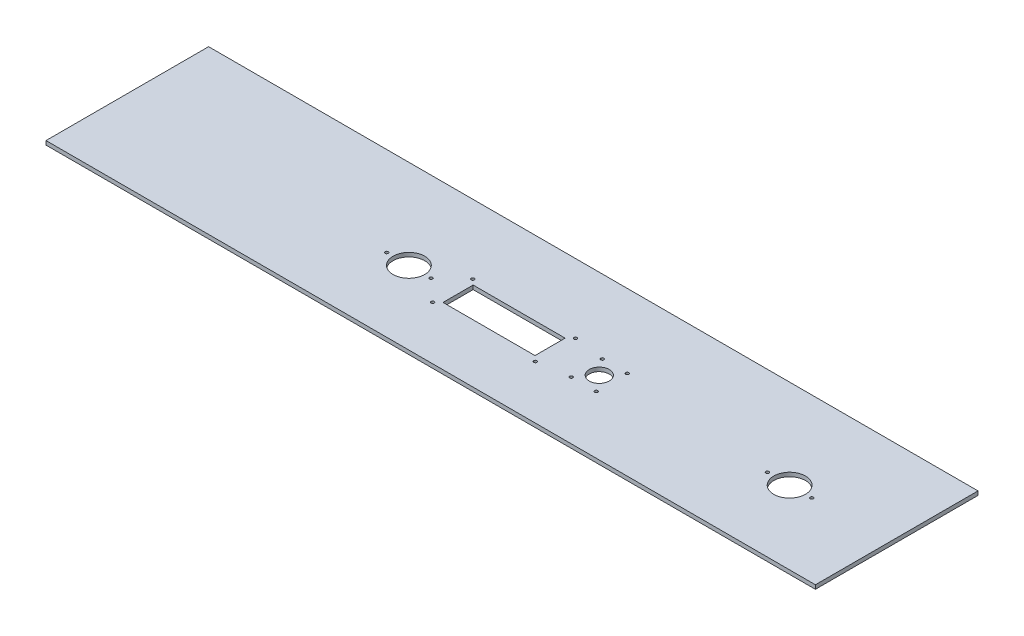
ISO-10303-21;
HEADER;
FILE_DESCRIPTION(('STEP AP214'),'2;1');
FILE_NAME('part.step','',(''),(''),'','','');
FILE_SCHEMA(('AUTOMOTIVE_DESIGN { 1 0 10303 214 1 1 1 1 }'));
ENDSEC;
DATA;
#1=APPLICATION_CONTEXT('core data for automotive mechanical design processes');
#2=APPLICATION_PROTOCOL_DEFINITION('international standard','automotive_design',2000,#1);
#3=PRODUCT_CONTEXT('',#1,'mechanical');
#4=PRODUCT('Part','Part','',(#3));
#5=PRODUCT_RELATED_PRODUCT_CATEGORY('part','',(#4));
#6=PRODUCT_DEFINITION_FORMATION('','',#4);
#7=PRODUCT_DEFINITION_CONTEXT('part definition',#1,'design');
#8=PRODUCT_DEFINITION('design','',#6,#7);
#9=PRODUCT_DEFINITION_SHAPE('','',#8);
#10=(LENGTH_UNIT() NAMED_UNIT(*) SI_UNIT(.MILLI.,.METRE.));
#11=(NAMED_UNIT(*) PLANE_ANGLE_UNIT() SI_UNIT($,.RADIAN.));
#12=(NAMED_UNIT(*) SI_UNIT($,.STERADIAN.) SOLID_ANGLE_UNIT());
#13=UNCERTAINTY_MEASURE_WITH_UNIT(LENGTH_MEASURE(1.E-05),#10,'distance_accuracy_value','');
#14=(GEOMETRIC_REPRESENTATION_CONTEXT(3) GLOBAL_UNCERTAINTY_ASSIGNED_CONTEXT((#13)) GLOBAL_UNIT_ASSIGNED_CONTEXT((#10,
#11,#12)) REPRESENTATION_CONTEXT('',''));
#15=CARTESIAN_POINT('',(0.,0.,0.));
#16=DIRECTION('',(0.,0.,1.));
#17=DIRECTION('',(1.,0.,0.));
#18=AXIS2_PLACEMENT_3D('',#15,#16,#17);
#19=CARTESIAN_POINT('',(307.975,3.175,65.0875));
#20=DIRECTION('',(-1.,0.,0.));
#21=DIRECTION('',(0.,0.,1.));
#22=AXIS2_PLACEMENT_3D('',#19,#20,#21);
#23=PLANE('',#22);
#24=DIRECTION('',(0.,0.,-1.));
#25=VECTOR('',#24,1.);
#26=CARTESIAN_POINT('',(307.975,0.,65.0875));
#27=LINE('',#26,#25);
#28=CARTESIAN_POINT('',(307.975,0.,65.0875));
#29=VERTEX_POINT('',#28);
#30=CARTESIAN_POINT('',(307.975,0.,-65.0875));
#31=VERTEX_POINT('',#30);
#32=EDGE_CURVE('E139',#29,#31,#27,.T.);
#33=ORIENTED_EDGE('',*,*,#32,.T.);
#34=DIRECTION('',(0.,-1.,0.));
#35=VECTOR('',#34,1.);
#36=CARTESIAN_POINT('',(307.975,3.175,-65.0875));
#37=LINE('',#36,#35);
#38=CARTESIAN_POINT('',(307.975,3.175,-65.0875));
#39=VERTEX_POINT('',#38);
#40=EDGE_CURVE('E11',#39,#31,#37,.T.);
#41=ORIENTED_EDGE('',*,*,#40,.F.);
#42=DIRECTION('',(0.,0.,-1.));
#43=VECTOR('',#42,1.);
#44=CARTESIAN_POINT('',(307.975,3.175,65.0875));
#45=LINE('',#44,#43);
#46=CARTESIAN_POINT('',(307.975,3.175,65.0875));
#47=VERTEX_POINT('',#46);
#48=EDGE_CURVE('E143',#47,#39,#45,.T.);
#49=ORIENTED_EDGE('',*,*,#48,.F.);
#50=DIRECTION('',(0.,-1.,0.));
#51=VECTOR('',#50,1.);
#52=CARTESIAN_POINT('',(307.975,3.175,65.0875));
#53=LINE('',#52,#51);
#54=EDGE_CURVE('E153',#47,#29,#53,.T.);
#55=ORIENTED_EDGE('',*,*,#54,.T.);
#56=EDGE_LOOP('',(#33,#41,#49,#55));
#57=FACE_BOUND('',#56,.T.);
#58=ADVANCED_FACE('F38',(#57),#23,.F.);
#59=CARTESIAN_POINT('',(-307.975,3.175,-65.0875));
#60=DIRECTION('',(0.,0.,1.));
#61=DIRECTION('',(1.,0.,0.));
#62=AXIS2_PLACEMENT_3D('',#59,#60,#61);
#63=PLANE('',#62);
#64=DIRECTION('',(-1.,0.,0.));
#65=VECTOR('',#64,1.);
#66=CARTESIAN_POINT('',(-307.975,0.,-65.0875));
#67=LINE('',#66,#65);
#68=CARTESIAN_POINT('',(-307.975,0.,-65.0875));
#69=VERTEX_POINT('',#68);
#70=EDGE_CURVE('E156',#31,#69,#67,.T.);
#71=ORIENTED_EDGE('',*,*,#70,.T.);
#72=DIRECTION('',(0.,-1.,0.));
#73=VECTOR('',#72,1.);
#74=CARTESIAN_POINT('',(-307.975,3.175,-65.0875));
#75=LINE('',#74,#73);
#76=CARTESIAN_POINT('',(-307.975,3.175,-65.0875));
#77=VERTEX_POINT('',#76);
#78=EDGE_CURVE('E45',#77,#69,#75,.T.);
#79=ORIENTED_EDGE('',*,*,#78,.F.);
#80=DIRECTION('',(-1.,0.,0.));
#81=VECTOR('',#80,1.);
#82=CARTESIAN_POINT('',(-307.975,3.175,-65.0875));
#83=LINE('',#82,#81);
#84=EDGE_CURVE('E146',#39,#77,#83,.T.);
#85=ORIENTED_EDGE('',*,*,#84,.F.);
#86=ORIENTED_EDGE('',*,*,#40,.T.);
#87=EDGE_LOOP('',(#71,#79,#85,#86));
#88=FACE_BOUND('',#87,.T.);
#89=ADVANCED_FACE('F184',(#88),#63,.F.);
#90=CARTESIAN_POINT('',(-307.975,3.175,65.0875));
#91=DIRECTION('',(1.,0.,0.));
#92=DIRECTION('',(0.,0.,-1.));
#93=AXIS2_PLACEMENT_3D('',#90,#91,#92);
#94=PLANE('',#93);
#95=DIRECTION('',(0.,0.,1.));
#96=VECTOR('',#95,1.);
#97=CARTESIAN_POINT('',(-307.975,0.,65.0875));
#98=LINE('',#97,#96);
#99=CARTESIAN_POINT('',(-307.975,0.,65.0875));
#100=VERTEX_POINT('',#99);
#101=EDGE_CURVE('E158',#69,#100,#98,.T.);
#102=ORIENTED_EDGE('',*,*,#101,.T.);
#103=DIRECTION('',(0.,-1.,0.));
#104=VECTOR('',#103,1.);
#105=CARTESIAN_POINT('',(-307.975,3.175,65.0875));
#106=LINE('',#105,#104);
#107=CARTESIAN_POINT('',(-307.975,3.175,65.0875));
#108=VERTEX_POINT('',#107);
#109=EDGE_CURVE('E163',#108,#100,#106,.T.);
#110=ORIENTED_EDGE('',*,*,#109,.F.);
#111=DIRECTION('',(0.,0.,1.));
#112=VECTOR('',#111,1.);
#113=CARTESIAN_POINT('',(-307.975,3.175,65.0875));
#114=LINE('',#113,#112);
#115=EDGE_CURVE('E149',#77,#108,#114,.T.);
#116=ORIENTED_EDGE('',*,*,#115,.F.);
#117=ORIENTED_EDGE('',*,*,#78,.T.);
#118=EDGE_LOOP('',(#102,#110,#116,#117));
#119=FACE_BOUND('',#118,.T.);
#120=ADVANCED_FACE('F170',(#119),#94,.F.);
#121=CARTESIAN_POINT('',(-307.975,3.175,65.0875));
#122=DIRECTION('',(0.,0.,-1.));
#123=DIRECTION('',(-1.,0.,0.));
#124=AXIS2_PLACEMENT_3D('',#121,#122,#123);
#125=PLANE('',#124);
#126=DIRECTION('',(1.,0.,0.));
#127=VECTOR('',#126,1.);
#128=CARTESIAN_POINT('',(-307.975,0.,65.0875));
#129=LINE('',#128,#127);
#130=EDGE_CURVE('E147',#100,#29,#129,.T.);
#131=ORIENTED_EDGE('',*,*,#130,.T.);
#132=ORIENTED_EDGE('',*,*,#54,.F.);
#133=DIRECTION('',(1.,0.,0.));
#134=VECTOR('',#133,1.);
#135=CARTESIAN_POINT('',(-307.975,3.175,65.0875));
#136=LINE('',#135,#134);
#137=EDGE_CURVE('E151',#108,#47,#136,.T.);
#138=ORIENTED_EDGE('',*,*,#137,.F.);
#139=ORIENTED_EDGE('',*,*,#109,.T.);
#140=EDGE_LOOP('',(#131,#132,#138,#139));
#141=FACE_BOUND('',#140,.T.);
#142=ADVANCED_FACE('F177',(#141),#125,.F.);
#143=CARTESIAN_POINT('',(0.,3.175,0.));
#144=DIRECTION('',(0.,-1.,0.));
#145=DIRECTION('',(0.,0.,-1.));
#146=AXIS2_PLACEMENT_3D('',#143,#144,#145);
#147=PLANE('',#146);
#148=CARTESIAN_POINT('',(86.2,3.175,18.85));
#149=DIRECTION('',(0.,1.,0.));
#150=DIRECTION('',(0.,0.,1.));
#151=AXIS2_PLACEMENT_3D('',#148,#149,#150);
#152=CIRCLE('',#151,1.25);
#153=CARTESIAN_POINT('',(86.2,3.175,20.1));
#154=VERTEX_POINT('',#153);
#155=EDGE_CURVE('E338',#154,#154,#152,.T.);
#156=ORIENTED_EDGE('',*,*,#155,.F.);
#157=EDGE_LOOP('',(#156));
#158=FACE_BOUND('',#157,.T.);
#159=CARTESIAN_POINT('',(-58.42,3.175,6.35));
#160=DIRECTION('',(0.,1.,0.));
#161=DIRECTION('',(0.,0.,1.));
#162=AXIS2_PLACEMENT_3D('',#159,#160,#161);
#163=CIRCLE('',#162,1.25);
#164=CARTESIAN_POINT('',(-58.42,3.175,7.60000000000001));
#165=VERTEX_POINT('',#164);
#166=EDGE_CURVE('E332',#165,#165,#163,.T.);
#167=ORIENTED_EDGE('',*,*,#166,.F.);
#168=EDGE_LOOP('',(#167));
#169=FACE_BOUND('',#168,.T.);
#170=CARTESIAN_POINT('',(-93.98,3.175,6.35));
#171=DIRECTION('',(0.,1.,0.));
#172=DIRECTION('',(0.,0.,1.));
#173=AXIS2_PLACEMENT_3D('',#170,#171,#172);
#174=CIRCLE('',#173,1.25);
#175=CARTESIAN_POINT('',(-93.98,3.175,7.6));
#176=VERTEX_POINT('',#175);
#177=EDGE_CURVE('E326',#176,#176,#174,.T.);
#178=ORIENTED_EDGE('',*,*,#177,.F.);
#179=EDGE_LOOP('',(#178));
#180=FACE_BOUND('',#179,.T.);
#181=CARTESIAN_POINT('',(-76.2,3.175,6.35));
#182=DIRECTION('',(0.,1.,0.));
#183=DIRECTION('',(0.,0.,1.));
#184=AXIS2_PLACEMENT_3D('',#181,#182,#183);
#185=CIRCLE('',#184,12.7);
#186=CARTESIAN_POINT('',(-76.2,3.175,19.05));
#187=VERTEX_POINT('',#186);
#188=EDGE_CURVE('E320',#187,#187,#185,.T.);
#189=ORIENTED_EDGE('',*,*,#188,.F.);
#190=EDGE_LOOP('',(#189));
#191=FACE_BOUND('',#190,.T.);
#192=CARTESIAN_POINT('',(-41.099999842,3.175,-9.69999990399998));
#193=DIRECTION('',(0.,1.,0.));
#194=DIRECTION('',(0.,0.,-1.));
#195=AXIS2_PLACEMENT_3D('',#192,#193,#194);
#196=CIRCLE('',#195,1.25);
#197=CARTESIAN_POINT('',(-41.099999842,3.175,-10.949999904));
#198=VERTEX_POINT('',#197);
#199=EDGE_CURVE('E359',#198,#198,#196,.T.);
#200=ORIENTED_EDGE('',*,*,#199,.F.);
#201=EDGE_LOOP('',(#200));
#202=FACE_BOUND('',#201,.T.);
#203=CARTESIAN_POINT('',(-41.099999842,3.175,22.399999904));
#204=DIRECTION('',(0.,1.,0.));
#205=DIRECTION('',(0.,0.,1.));
#206=AXIS2_PLACEMENT_3D('',#203,#204,#205);
#207=CIRCLE('',#206,1.25);
#208=CARTESIAN_POINT('',(-41.099999842,3.175,23.649999904));
#209=VERTEX_POINT('',#208);
#210=EDGE_CURVE('E354',#209,#209,#207,.T.);
#211=ORIENTED_EDGE('',*,*,#210,.F.);
#212=EDGE_LOOP('',(#211));
#213=FACE_BOUND('',#212,.T.);
#214=CARTESIAN_POINT('',(41.099999842,3.175,22.399999904));
#215=DIRECTION('',(0.,1.,0.));
#216=DIRECTION('',(0.,0.,-1.));
#217=AXIS2_PLACEMENT_3D('',#214,#215,#216);
#218=CIRCLE('',#217,1.25);
#219=CARTESIAN_POINT('',(41.099999842,3.175,21.149999904));
#220=VERTEX_POINT('',#219);
#221=EDGE_CURVE('E348',#220,#220,#218,.T.);
#222=ORIENTED_EDGE('',*,*,#221,.F.);
#223=EDGE_LOOP('',(#222));
#224=FACE_BOUND('',#223,.T.);
#225=CARTESIAN_POINT('',(41.099999842,3.175,-9.69999990399999));
#226=DIRECTION('',(0.,1.,0.));
#227=DIRECTION('',(0.,0.,1.));
#228=AXIS2_PLACEMENT_3D('',#225,#226,#227);
#229=CIRCLE('',#228,1.25);
#230=CARTESIAN_POINT('',(41.099999842,3.175,-8.449999904));
#231=VERTEX_POINT('',#230);
#232=EDGE_CURVE('E133',#231,#231,#229,.T.);
#233=ORIENTED_EDGE('',*,*,#232,.F.);
#234=EDGE_LOOP('',(#233));
#235=FACE_BOUND('',#234,.T.);
#236=CARTESIAN_POINT('',(76.2,3.175,6.35));
#237=DIRECTION('',(0.,1.,0.));
#238=DIRECTION('',(0.,0.,1.));
#239=AXIS2_PLACEMENT_3D('',#236,#237,#238);
#240=CIRCLE('',#239,8.00000000000001);
#241=CARTESIAN_POINT('',(76.2,3.175,14.35));
#242=VERTEX_POINT('',#241);
#243=EDGE_CURVE('E285',#242,#242,#240,.T.);
#244=ORIENTED_EDGE('',*,*,#243,.F.);
#245=EDGE_LOOP('',(#244));
#246=FACE_BOUND('',#245,.T.);
#247=CARTESIAN_POINT('',(66.2,3.175,-6.15));
#248=DIRECTION('',(0.,1.,0.));
#249=DIRECTION('',(0.,0.,1.));
#250=AXIS2_PLACEMENT_3D('',#247,#248,#249);
#251=CIRCLE('',#250,1.25);
#252=CARTESIAN_POINT('',(66.2,3.175,-4.9));
#253=VERTEX_POINT('',#252);
#254=EDGE_CURVE('E278',#253,#253,#251,.T.);
#255=ORIENTED_EDGE('',*,*,#254,.F.);
#256=EDGE_LOOP('',(#255));
#257=FACE_BOUND('',#256,.T.);
#258=CARTESIAN_POINT('',(66.2,3.175,18.85));
#259=DIRECTION('',(0.,1.,0.));
#260=DIRECTION('',(0.,0.,1.));
#261=AXIS2_PLACEMENT_3D('',#258,#259,#260);
#262=CIRCLE('',#261,1.25);
#263=CARTESIAN_POINT('',(66.2,3.175,20.1));
#264=VERTEX_POINT('',#263);
#265=EDGE_CURVE('E283',#264,#264,#262,.T.);
#266=ORIENTED_EDGE('',*,*,#265,.F.);
#267=EDGE_LOOP('',(#266));
#268=FACE_BOUND('',#267,.T.);
#269=CARTESIAN_POINT('',(86.2,3.175,-6.15));
#270=DIRECTION('',(0.,1.,0.));
#271=DIRECTION('',(0.,0.,1.));
#272=AXIS2_PLACEMENT_3D('',#269,#270,#271);
#273=CIRCLE('',#272,1.25);
#274=CARTESIAN_POINT('',(86.2,3.175,-4.9));
#275=VERTEX_POINT('',#274);
#276=EDGE_CURVE('E294',#275,#275,#273,.T.);
#277=ORIENTED_EDGE('',*,*,#276,.F.);
#278=EDGE_LOOP('',(#277));
#279=FACE_BOUND('',#278,.T.);
#280=CARTESIAN_POINT('',(228.6,3.175,6.34999999999995));
#281=DIRECTION('',(0.,1.,0.));
#282=DIRECTION('',(0.,0.,-1.));
#283=AXIS2_PLACEMENT_3D('',#280,#281,#282);
#284=CIRCLE('',#283,12.7);
#285=CARTESIAN_POINT('',(228.6,3.175,-6.3500000000001));
#286=VERTEX_POINT('',#285);
#287=EDGE_CURVE('E303',#286,#286,#284,.T.);
#288=ORIENTED_EDGE('',*,*,#287,.F.);
#289=EDGE_LOOP('',(#288));
#290=FACE_BOUND('',#289,.T.);
#291=CARTESIAN_POINT('',(210.82,3.175,6.34999999999995));
#292=DIRECTION('',(0.,1.,0.));
#293=DIRECTION('',(0.,0.,-1.));
#294=AXIS2_PLACEMENT_3D('',#291,#292,#293);
#295=CIRCLE('',#294,1.25000000000001);
#296=CARTESIAN_POINT('',(210.82,3.175,5.09999999999994));
#297=VERTEX_POINT('',#296);
#298=EDGE_CURVE('E315',#297,#297,#295,.T.);
#299=ORIENTED_EDGE('',*,*,#298,.F.);
#300=EDGE_LOOP('',(#299));
#301=FACE_BOUND('',#300,.T.);
#302=CARTESIAN_POINT('',(246.38,3.175,6.34999999999992));
#303=DIRECTION('',(0.,1.,0.));
#304=DIRECTION('',(0.,0.,-1.));
#305=AXIS2_PLACEMENT_3D('',#302,#303,#304);
#306=CIRCLE('',#305,1.25000000000004);
#307=CARTESIAN_POINT('',(246.38,3.175,5.09999999999988));
#308=VERTEX_POINT('',#307);
#309=EDGE_CURVE('E293',#308,#308,#306,.T.);
#310=ORIENTED_EDGE('',*,*,#309,.F.);
#311=EDGE_LOOP('',(#310));
#312=FACE_BOUND('',#311,.T.);
#313=DIRECTION('',(-1.,0.,0.));
#314=VECTOR('',#313,1.);
#315=CARTESIAN_POINT('',(-36.83,3.175,-5.715));
#316=LINE('',#315,#314);
#317=CARTESIAN_POINT('',(36.83,3.175,-5.715));
#318=VERTEX_POINT('',#317);
#319=CARTESIAN_POINT('',(-36.83,3.175,-5.715));
#320=VERTEX_POINT('',#319);
#321=EDGE_CURVE('E132',#318,#320,#316,.T.);
#322=ORIENTED_EDGE('',*,*,#321,.F.);
#323=DIRECTION('',(0.,0.,-1.));
#324=VECTOR('',#323,1.);
#325=CARTESIAN_POINT('',(36.83,3.175,18.415));
#326=LINE('',#325,#324);
#327=CARTESIAN_POINT('',(36.83,3.175,18.415));
#328=VERTEX_POINT('',#327);
#329=EDGE_CURVE('E52',#328,#318,#326,.T.);
#330=ORIENTED_EDGE('',*,*,#329,.F.);
#331=DIRECTION('',(1.,0.,0.));
#332=VECTOR('',#331,1.);
#333=CARTESIAN_POINT('',(-36.83,3.175,18.415));
#334=LINE('',#333,#332);
#335=CARTESIAN_POINT('',(-36.83,3.175,18.415));
#336=VERTEX_POINT('',#335);
#337=EDGE_CURVE('E120',#336,#328,#334,.T.);
#338=ORIENTED_EDGE('',*,*,#337,.F.);
#339=DIRECTION('',(0.,0.,1.));
#340=VECTOR('',#339,1.);
#341=CARTESIAN_POINT('',(-36.83,3.175,18.415));
#342=LINE('',#341,#340);
#343=EDGE_CURVE('E123',#320,#336,#342,.T.);
#344=ORIENTED_EDGE('',*,*,#343,.F.);
#345=EDGE_LOOP('',(#322,#330,#338,#344));
#346=FACE_BOUND('',#345,.T.);
#347=ORIENTED_EDGE('',*,*,#48,.T.);
#348=ORIENTED_EDGE('',*,*,#84,.T.);
#349=ORIENTED_EDGE('',*,*,#115,.T.);
#350=ORIENTED_EDGE('',*,*,#137,.T.);
#351=EDGE_LOOP('',(#347,#348,#349,#350));
#352=FACE_BOUND('',#351,.T.);
#353=ADVANCED_FACE('F183',(#158,#169,#180,#191,#202,#213,#224,#235,#246,#257,#268,#279,#290,
#301,#312,#346,#352),#147,.F.);
#354=CARTESIAN_POINT('',(0.,0.,0.));
#355=DIRECTION('',(0.,-1.,0.));
#356=DIRECTION('',(0.,0.,-1.));
#357=AXIS2_PLACEMENT_3D('',#354,#355,#356);
#358=PLANE('',#357);
#359=CARTESIAN_POINT('',(86.2,0.,18.85));
#360=DIRECTION('',(0.,1.,0.));
#361=DIRECTION('',(0.,0.,1.));
#362=AXIS2_PLACEMENT_3D('',#359,#360,#361);
#363=CIRCLE('',#362,1.25);
#364=CARTESIAN_POINT('',(86.2,0.,20.1));
#365=VERTEX_POINT('',#364);
#366=EDGE_CURVE('E297',#365,#365,#363,.T.);
#367=ORIENTED_EDGE('',*,*,#366,.T.);
#368=EDGE_LOOP('',(#367));
#369=FACE_BOUND('',#368,.T.);
#370=CARTESIAN_POINT('',(-58.42,0.,6.35));
#371=DIRECTION('',(0.,1.,0.));
#372=DIRECTION('',(0.,0.,1.));
#373=AXIS2_PLACEMENT_3D('',#370,#371,#372);
#374=CIRCLE('',#373,1.25);
#375=CARTESIAN_POINT('',(-58.42,0.,7.60000000000001));
#376=VERTEX_POINT('',#375);
#377=EDGE_CURVE('E335',#376,#376,#374,.T.);
#378=ORIENTED_EDGE('',*,*,#377,.T.);
#379=EDGE_LOOP('',(#378));
#380=FACE_BOUND('',#379,.T.);
#381=CARTESIAN_POINT('',(-93.98,0.,6.35));
#382=DIRECTION('',(0.,1.,0.));
#383=DIRECTION('',(0.,0.,1.));
#384=AXIS2_PLACEMENT_3D('',#381,#382,#383);
#385=CIRCLE('',#384,1.25);
#386=CARTESIAN_POINT('',(-93.98,0.,7.6));
#387=VERTEX_POINT('',#386);
#388=EDGE_CURVE('E329',#387,#387,#385,.T.);
#389=ORIENTED_EDGE('',*,*,#388,.T.);
#390=EDGE_LOOP('',(#389));
#391=FACE_BOUND('',#390,.T.);
#392=CARTESIAN_POINT('',(-76.2,0.,6.35));
#393=DIRECTION('',(0.,1.,0.));
#394=DIRECTION('',(0.,0.,1.));
#395=AXIS2_PLACEMENT_3D('',#392,#393,#394);
#396=CIRCLE('',#395,12.7);
#397=CARTESIAN_POINT('',(-76.2,0.,19.05));
#398=VERTEX_POINT('',#397);
#399=EDGE_CURVE('E323',#398,#398,#396,.T.);
#400=ORIENTED_EDGE('',*,*,#399,.T.);
#401=EDGE_LOOP('',(#400));
#402=FACE_BOUND('',#401,.T.);
#403=CARTESIAN_POINT('',(-41.099999842,0.,-9.69999990399998));
#404=DIRECTION('',(0.,1.,0.));
#405=DIRECTION('',(0.,0.,-1.));
#406=AXIS2_PLACEMENT_3D('',#403,#404,#405);
#407=CIRCLE('',#406,1.25);
#408=CARTESIAN_POINT('',(-41.099999842,0.,-10.949999904));
#409=VERTEX_POINT('',#408);
#410=EDGE_CURVE('E126',#409,#409,#407,.T.);
#411=ORIENTED_EDGE('',*,*,#410,.T.);
#412=EDGE_LOOP('',(#411));
#413=FACE_BOUND('',#412,.T.);
#414=CARTESIAN_POINT('',(-41.099999842,0.,22.399999904));
#415=DIRECTION('',(0.,1.,0.));
#416=DIRECTION('',(0.,0.,1.));
#417=AXIS2_PLACEMENT_3D('',#414,#415,#416);
#418=CIRCLE('',#417,1.25);
#419=CARTESIAN_POINT('',(-41.099999842,0.,23.649999904));
#420=VERTEX_POINT('',#419);
#421=EDGE_CURVE('E357',#420,#420,#418,.T.);
#422=ORIENTED_EDGE('',*,*,#421,.T.);
#423=EDGE_LOOP('',(#422));
#424=FACE_BOUND('',#423,.T.);
#425=CARTESIAN_POINT('',(41.099999842,0.,22.399999904));
#426=DIRECTION('',(0.,1.,0.));
#427=DIRECTION('',(0.,0.,-1.));
#428=AXIS2_PLACEMENT_3D('',#425,#426,#427);
#429=CIRCLE('',#428,1.25);
#430=CARTESIAN_POINT('',(41.099999842,0.,21.149999904));
#431=VERTEX_POINT('',#430);
#432=EDGE_CURVE('E351',#431,#431,#429,.T.);
#433=ORIENTED_EDGE('',*,*,#432,.T.);
#434=EDGE_LOOP('',(#433));
#435=FACE_BOUND('',#434,.T.);
#436=CARTESIAN_POINT('',(41.099999842,0.,-9.69999990399999));
#437=DIRECTION('',(0.,1.,0.));
#438=DIRECTION('',(0.,0.,1.));
#439=AXIS2_PLACEMENT_3D('',#436,#437,#438);
#440=CIRCLE('',#439,1.25);
#441=CARTESIAN_POINT('',(41.099999842,0.,-8.449999904));
#442=VERTEX_POINT('',#441);
#443=EDGE_CURVE('E345',#442,#442,#440,.T.);
#444=ORIENTED_EDGE('',*,*,#443,.T.);
#445=EDGE_LOOP('',(#444));
#446=FACE_BOUND('',#445,.T.);
#447=CARTESIAN_POINT('',(76.2,0.,6.35));
#448=DIRECTION('',(0.,1.,0.));
#449=DIRECTION('',(0.,0.,1.));
#450=AXIS2_PLACEMENT_3D('',#447,#448,#449);
#451=CIRCLE('',#450,8.00000000000001);
#452=CARTESIAN_POINT('',(76.2,0.,14.35));
#453=VERTEX_POINT('',#452);
#454=EDGE_CURVE('E290',#453,#453,#451,.T.);
#455=ORIENTED_EDGE('',*,*,#454,.T.);
#456=EDGE_LOOP('',(#455));
#457=FACE_BOUND('',#456,.T.);
#458=CARTESIAN_POINT('',(66.2,0.,-6.15));
#459=DIRECTION('',(0.,1.,0.));
#460=DIRECTION('',(0.,0.,1.));
#461=AXIS2_PLACEMENT_3D('',#458,#459,#460);
#462=CIRCLE('',#461,1.25);
#463=CARTESIAN_POINT('',(66.2,0.,-4.9));
#464=VERTEX_POINT('',#463);
#465=EDGE_CURVE('E275',#464,#464,#462,.T.);
#466=ORIENTED_EDGE('',*,*,#465,.T.);
#467=EDGE_LOOP('',(#466));
#468=FACE_BOUND('',#467,.T.);
#469=CARTESIAN_POINT('',(66.2,0.,18.85));
#470=DIRECTION('',(0.,1.,0.));
#471=DIRECTION('',(0.,0.,1.));
#472=AXIS2_PLACEMENT_3D('',#469,#470,#471);
#473=CIRCLE('',#472,1.25);
#474=CARTESIAN_POINT('',(66.2,0.,20.1));
#475=VERTEX_POINT('',#474);
#476=EDGE_CURVE('E280',#475,#475,#473,.T.);
#477=ORIENTED_EDGE('',*,*,#476,.T.);
#478=EDGE_LOOP('',(#477));
#479=FACE_BOUND('',#478,.T.);
#480=CARTESIAN_POINT('',(86.2,0.,-6.15));
#481=DIRECTION('',(0.,1.,0.));
#482=DIRECTION('',(0.,0.,1.));
#483=AXIS2_PLACEMENT_3D('',#480,#481,#482);
#484=CIRCLE('',#483,1.25);
#485=CARTESIAN_POINT('',(86.2,0.,-4.9));
#486=VERTEX_POINT('',#485);
#487=EDGE_CURVE('E298',#486,#486,#484,.T.);
#488=ORIENTED_EDGE('',*,*,#487,.T.);
#489=EDGE_LOOP('',(#488));
#490=FACE_BOUND('',#489,.T.);
#491=CARTESIAN_POINT('',(228.6,0.,6.34999999999995));
#492=DIRECTION('',(0.,1.,0.));
#493=DIRECTION('',(0.,0.,-1.));
#494=AXIS2_PLACEMENT_3D('',#491,#492,#493);
#495=CIRCLE('',#494,12.7);
#496=CARTESIAN_POINT('',(228.6,0.,-6.3500000000001));
#497=VERTEX_POINT('',#496);
#498=EDGE_CURVE('E307',#497,#497,#495,.T.);
#499=ORIENTED_EDGE('',*,*,#498,.T.);
#500=EDGE_LOOP('',(#499));
#501=FACE_BOUND('',#500,.T.);
#502=CARTESIAN_POINT('',(210.82,0.,6.34999999999995));
#503=DIRECTION('',(0.,1.,0.));
#504=DIRECTION('',(0.,0.,-1.));
#505=AXIS2_PLACEMENT_3D('',#502,#503,#504);
#506=CIRCLE('',#505,1.25000000000001);
#507=CARTESIAN_POINT('',(210.82,0.,5.09999999999994));
#508=VERTEX_POINT('',#507);
#509=EDGE_CURVE('E306',#508,#508,#506,.T.);
#510=ORIENTED_EDGE('',*,*,#509,.T.);
#511=EDGE_LOOP('',(#510));
#512=FACE_BOUND('',#511,.T.);
#513=CARTESIAN_POINT('',(246.38,0.,6.34999999999992));
#514=DIRECTION('',(0.,1.,0.));
#515=DIRECTION('',(0.,0.,-1.));
#516=AXIS2_PLACEMENT_3D('',#513,#514,#515);
#517=CIRCLE('',#516,1.25000000000004);
#518=CARTESIAN_POINT('',(246.38,0.,5.09999999999988));
#519=VERTEX_POINT('',#518);
#520=EDGE_CURVE('E312',#519,#519,#517,.T.);
#521=ORIENTED_EDGE('',*,*,#520,.T.);
#522=EDGE_LOOP('',(#521));
#523=FACE_BOUND('',#522,.T.);
#524=DIRECTION('',(0.,0.,-1.));
#525=VECTOR('',#524,1.);
#526=CARTESIAN_POINT('',(36.83,0.,18.415));
#527=LINE('',#526,#525);
#528=CARTESIAN_POINT('',(36.83,0.,18.415));
#529=VERTEX_POINT('',#528);
#530=CARTESIAN_POINT('',(36.83,0.,-5.715));
#531=VERTEX_POINT('',#530);
#532=EDGE_CURVE('E104',#529,#531,#527,.T.);
#533=ORIENTED_EDGE('',*,*,#532,.T.);
#534=DIRECTION('',(-1.,0.,0.));
#535=VECTOR('',#534,1.);
#536=CARTESIAN_POINT('',(-36.83,0.,-5.715));
#537=LINE('',#536,#535);
#538=CARTESIAN_POINT('',(-36.83,0.,-5.715));
#539=VERTEX_POINT('',#538);
#540=EDGE_CURVE('E113',#531,#539,#537,.T.);
#541=ORIENTED_EDGE('',*,*,#540,.T.);
#542=DIRECTION('',(0.,0.,1.));
#543=VECTOR('',#542,1.);
#544=CARTESIAN_POINT('',(-36.83,0.,18.415));
#545=LINE('',#544,#543);
#546=CARTESIAN_POINT('',(-36.83,0.,18.415));
#547=VERTEX_POINT('',#546);
#548=EDGE_CURVE('E60',#539,#547,#545,.T.);
#549=ORIENTED_EDGE('',*,*,#548,.T.);
#550=DIRECTION('',(1.,0.,0.));
#551=VECTOR('',#550,1.);
#552=CARTESIAN_POINT('',(-36.83,0.,18.415));
#553=LINE('',#552,#551);
#554=EDGE_CURVE('E110',#547,#529,#553,.T.);
#555=ORIENTED_EDGE('',*,*,#554,.T.);
#556=EDGE_LOOP('',(#533,#541,#549,#555));
#557=FACE_BOUND('',#556,.T.);
#558=ORIENTED_EDGE('',*,*,#32,.F.);
#559=ORIENTED_EDGE('',*,*,#130,.F.);
#560=ORIENTED_EDGE('',*,*,#101,.F.);
#561=ORIENTED_EDGE('',*,*,#70,.F.);
#562=EDGE_LOOP('',(#558,#559,#560,#561));
#563=FACE_BOUND('',#562,.T.);
#564=ADVANCED_FACE('F117',(#369,#380,#391,#402,#413,#424,#435,#446,#457,#468,#479,#490,#501,
#512,#523,#557,#563),#358,.T.);
#565=CARTESIAN_POINT('',(36.83,0.,18.415));
#566=DIRECTION('',(1.,0.,0.));
#567=DIRECTION('',(0.,0.,-1.));
#568=AXIS2_PLACEMENT_3D('',#565,#566,#567);
#569=PLANE('',#568);
#570=ORIENTED_EDGE('',*,*,#329,.T.);
#571=DIRECTION('',(0.,1.,0.));
#572=VECTOR('',#571,1.);
#573=CARTESIAN_POINT('',(36.83,0.,-5.715));
#574=LINE('',#573,#572);
#575=EDGE_CURVE('E100',#531,#318,#574,.T.);
#576=ORIENTED_EDGE('',*,*,#575,.F.);
#577=ORIENTED_EDGE('',*,*,#532,.F.);
#578=DIRECTION('',(0.,1.,0.));
#579=VECTOR('',#578,1.);
#580=CARTESIAN_POINT('',(36.83,0.,18.415));
#581=LINE('',#580,#579);
#582=EDGE_CURVE('E137',#529,#328,#581,.T.);
#583=ORIENTED_EDGE('',*,*,#582,.T.);
#584=EDGE_LOOP('',(#570,#576,#577,#583));
#585=FACE_BOUND('',#584,.T.);
#586=ADVANCED_FACE('F102',(#585),#569,.F.);
#587=CARTESIAN_POINT('',(-36.83,0.,18.415));
#588=DIRECTION('',(0.,0.,1.));
#589=DIRECTION('',(1.,0.,0.));
#590=AXIS2_PLACEMENT_3D('',#587,#588,#589);
#591=PLANE('',#590);
#592=ORIENTED_EDGE('',*,*,#337,.T.);
#593=ORIENTED_EDGE('',*,*,#582,.F.);
#594=ORIENTED_EDGE('',*,*,#554,.F.);
#595=DIRECTION('',(0.,1.,0.));
#596=VECTOR('',#595,1.);
#597=CARTESIAN_POINT('',(-36.83,0.,18.415));
#598=LINE('',#597,#596);
#599=EDGE_CURVE('E140',#547,#336,#598,.T.);
#600=ORIENTED_EDGE('',*,*,#599,.T.);
#601=EDGE_LOOP('',(#592,#593,#594,#600));
#602=FACE_BOUND('',#601,.T.);
#603=ADVANCED_FACE('F202',(#602),#591,.F.);
#604=CARTESIAN_POINT('',(-36.83,0.,18.415));
#605=DIRECTION('',(-1.,0.,0.));
#606=DIRECTION('',(0.,0.,1.));
#607=AXIS2_PLACEMENT_3D('',#604,#605,#606);
#608=PLANE('',#607);
#609=ORIENTED_EDGE('',*,*,#343,.T.);
#610=ORIENTED_EDGE('',*,*,#599,.F.);
#611=ORIENTED_EDGE('',*,*,#548,.F.);
#612=DIRECTION('',(0.,1.,0.));
#613=VECTOR('',#612,1.);
#614=CARTESIAN_POINT('',(-36.83,0.,-5.715));
#615=LINE('',#614,#613);
#616=EDGE_CURVE('E109',#539,#320,#615,.T.);
#617=ORIENTED_EDGE('',*,*,#616,.T.);
#618=EDGE_LOOP('',(#609,#610,#611,#617));
#619=FACE_BOUND('',#618,.T.);
#620=ADVANCED_FACE('F206',(#619),#608,.F.);
#621=CARTESIAN_POINT('',(-36.83,0.,-5.715));
#622=DIRECTION('',(0.,0.,-1.));
#623=DIRECTION('',(-1.,0.,0.));
#624=AXIS2_PLACEMENT_3D('',#621,#622,#623);
#625=PLANE('',#624);
#626=ORIENTED_EDGE('',*,*,#321,.T.);
#627=ORIENTED_EDGE('',*,*,#616,.F.);
#628=ORIENTED_EDGE('',*,*,#540,.F.);
#629=ORIENTED_EDGE('',*,*,#575,.T.);
#630=EDGE_LOOP('',(#626,#627,#628,#629));
#631=FACE_BOUND('',#630,.T.);
#632=ADVANCED_FACE('F114',(#631),#625,.F.);
#633=CARTESIAN_POINT('',(246.38,0.,6.34999999999992));
#634=DIRECTION('',(0.,1.,0.));
#635=DIRECTION('',(0.,0.,1.));
#636=AXIS2_PLACEMENT_3D('',#633,#634,#635);
#637=CYLINDRICAL_SURFACE('',#636,1.25000000000004);
#638=ORIENTED_EDGE('',*,*,#520,.F.);
#639=EDGE_LOOP('',(#638));
#640=FACE_BOUND('',#639,.T.);
#641=ORIENTED_EDGE('',*,*,#309,.T.);
#642=EDGE_LOOP('',(#641));
#643=FACE_BOUND('',#642,.T.);
#644=ADVANCED_FACE('F205',(#640,#643),#637,.F.);
#645=CARTESIAN_POINT('',(210.82,0.,6.34999999999995));
#646=DIRECTION('',(0.,1.,0.));
#647=DIRECTION('',(0.,0.,1.));
#648=AXIS2_PLACEMENT_3D('',#645,#646,#647);
#649=CYLINDRICAL_SURFACE('',#648,1.25000000000001);
#650=ORIENTED_EDGE('',*,*,#509,.F.);
#651=EDGE_LOOP('',(#650));
#652=FACE_BOUND('',#651,.T.);
#653=ORIENTED_EDGE('',*,*,#298,.T.);
#654=EDGE_LOOP('',(#653));
#655=FACE_BOUND('',#654,.T.);
#656=ADVANCED_FACE('F245',(#652,#655),#649,.F.);
#657=CARTESIAN_POINT('',(228.6,0.,6.34999999999995));
#658=DIRECTION('',(0.,1.,0.));
#659=DIRECTION('',(0.,0.,1.));
#660=AXIS2_PLACEMENT_3D('',#657,#658,#659);
#661=CYLINDRICAL_SURFACE('',#660,12.7);
#662=ORIENTED_EDGE('',*,*,#498,.F.);
#663=EDGE_LOOP('',(#662));
#664=FACE_BOUND('',#663,.T.);
#665=ORIENTED_EDGE('',*,*,#287,.T.);
#666=EDGE_LOOP('',(#665));
#667=FACE_BOUND('',#666,.T.);
#668=ADVANCED_FACE('F248',(#664,#667),#661,.F.);
#669=CARTESIAN_POINT('',(86.2,0.,-6.15));
#670=DIRECTION('',(0.,1.,0.));
#671=DIRECTION('',(0.,0.,1.));
#672=AXIS2_PLACEMENT_3D('',#669,#670,#671);
#673=CYLINDRICAL_SURFACE('',#672,1.25);
#674=ORIENTED_EDGE('',*,*,#487,.F.);
#675=EDGE_LOOP('',(#674));
#676=FACE_BOUND('',#675,.T.);
#677=ORIENTED_EDGE('',*,*,#276,.T.);
#678=EDGE_LOOP('',(#677));
#679=FACE_BOUND('',#678,.T.);
#680=ADVANCED_FACE('F255',(#676,#679),#673,.F.);
#681=CARTESIAN_POINT('',(66.2,0.,18.85));
#682=DIRECTION('',(0.,1.,0.));
#683=DIRECTION('',(0.,0.,1.));
#684=AXIS2_PLACEMENT_3D('',#681,#682,#683);
#685=CYLINDRICAL_SURFACE('',#684,1.25);
#686=ORIENTED_EDGE('',*,*,#476,.F.);
#687=EDGE_LOOP('',(#686));
#688=FACE_BOUND('',#687,.T.);
#689=ORIENTED_EDGE('',*,*,#265,.T.);
#690=EDGE_LOOP('',(#689));
#691=FACE_BOUND('',#690,.T.);
#692=ADVANCED_FACE('F257',(#688,#691),#685,.F.);
#693=CARTESIAN_POINT('',(66.2,0.,-6.15));
#694=DIRECTION('',(0.,1.,0.));
#695=DIRECTION('',(0.,0.,1.));
#696=AXIS2_PLACEMENT_3D('',#693,#694,#695);
#697=CYLINDRICAL_SURFACE('',#696,1.25);
#698=ORIENTED_EDGE('',*,*,#465,.F.);
#699=EDGE_LOOP('',(#698));
#700=FACE_BOUND('',#699,.T.);
#701=ORIENTED_EDGE('',*,*,#254,.T.);
#702=EDGE_LOOP('',(#701));
#703=FACE_BOUND('',#702,.T.);
#704=ADVANCED_FACE('F260',(#700,#703),#697,.F.);
#705=CARTESIAN_POINT('',(76.2,0.,6.35));
#706=DIRECTION('',(0.,1.,0.));
#707=DIRECTION('',(0.,0.,1.));
#708=AXIS2_PLACEMENT_3D('',#705,#706,#707);
#709=CYLINDRICAL_SURFACE('',#708,8.00000000000001);
#710=ORIENTED_EDGE('',*,*,#454,.F.);
#711=EDGE_LOOP('',(#710));
#712=FACE_BOUND('',#711,.T.);
#713=ORIENTED_EDGE('',*,*,#243,.T.);
#714=EDGE_LOOP('',(#713));
#715=FACE_BOUND('',#714,.T.);
#716=ADVANCED_FACE('F228',(#712,#715),#709,.F.);
#717=CARTESIAN_POINT('',(41.099999842,0.,-9.69999990399999));
#718=DIRECTION('',(0.,1.,0.));
#719=DIRECTION('',(0.,0.,1.));
#720=AXIS2_PLACEMENT_3D('',#717,#718,#719);
#721=CYLINDRICAL_SURFACE('',#720,1.25);
#722=ORIENTED_EDGE('',*,*,#443,.F.);
#723=EDGE_LOOP('',(#722));
#724=FACE_BOUND('',#723,.T.);
#725=ORIENTED_EDGE('',*,*,#232,.T.);
#726=EDGE_LOOP('',(#725));
#727=FACE_BOUND('',#726,.T.);
#728=ADVANCED_FACE('F224',(#724,#727),#721,.F.);
#729=CARTESIAN_POINT('',(41.099999842,0.,22.399999904));
#730=DIRECTION('',(0.,1.,0.));
#731=DIRECTION('',(0.,0.,1.));
#732=AXIS2_PLACEMENT_3D('',#729,#730,#731);
#733=CYLINDRICAL_SURFACE('',#732,1.25);
#734=ORIENTED_EDGE('',*,*,#432,.F.);
#735=EDGE_LOOP('',(#734));
#736=FACE_BOUND('',#735,.T.);
#737=ORIENTED_EDGE('',*,*,#221,.T.);
#738=EDGE_LOOP('',(#737));
#739=FACE_BOUND('',#738,.T.);
#740=ADVANCED_FACE('F220',(#736,#739),#733,.F.);
#741=CARTESIAN_POINT('',(-41.099999842,0.,22.399999904));
#742=DIRECTION('',(0.,1.,0.));
#743=DIRECTION('',(0.,0.,1.));
#744=AXIS2_PLACEMENT_3D('',#741,#742,#743);
#745=CYLINDRICAL_SURFACE('',#744,1.25);
#746=ORIENTED_EDGE('',*,*,#421,.F.);
#747=EDGE_LOOP('',(#746));
#748=FACE_BOUND('',#747,.T.);
#749=ORIENTED_EDGE('',*,*,#210,.T.);
#750=EDGE_LOOP('',(#749));
#751=FACE_BOUND('',#750,.T.);
#752=ADVANCED_FACE('F216',(#748,#751),#745,.F.);
#753=CARTESIAN_POINT('',(-41.099999842,0.,-9.69999990399998));
#754=DIRECTION('',(0.,1.,0.));
#755=DIRECTION('',(0.,0.,1.));
#756=AXIS2_PLACEMENT_3D('',#753,#754,#755);
#757=CYLINDRICAL_SURFACE('',#756,1.25);
#758=ORIENTED_EDGE('',*,*,#410,.F.);
#759=EDGE_LOOP('',(#758));
#760=FACE_BOUND('',#759,.T.);
#761=ORIENTED_EDGE('',*,*,#199,.T.);
#762=EDGE_LOOP('',(#761));
#763=FACE_BOUND('',#762,.T.);
#764=ADVANCED_FACE('F212',(#760,#763),#757,.F.);
#765=CARTESIAN_POINT('',(-76.2,0.,6.35));
#766=DIRECTION('',(0.,1.,0.));
#767=DIRECTION('',(0.,0.,1.));
#768=AXIS2_PLACEMENT_3D('',#765,#766,#767);
#769=CYLINDRICAL_SURFACE('',#768,12.7);
#770=ORIENTED_EDGE('',*,*,#399,.F.);
#771=EDGE_LOOP('',(#770));
#772=FACE_BOUND('',#771,.T.);
#773=ORIENTED_EDGE('',*,*,#188,.T.);
#774=EDGE_LOOP('',(#773));
#775=FACE_BOUND('',#774,.T.);
#776=ADVANCED_FACE('F215',(#772,#775),#769,.F.);
#777=CARTESIAN_POINT('',(-93.98,0.,6.35));
#778=DIRECTION('',(0.,1.,0.));
#779=DIRECTION('',(0.,0.,1.));
#780=AXIS2_PLACEMENT_3D('',#777,#778,#779);
#781=CYLINDRICAL_SURFACE('',#780,1.25);
#782=ORIENTED_EDGE('',*,*,#388,.F.);
#783=EDGE_LOOP('',(#782));
#784=FACE_BOUND('',#783,.T.);
#785=ORIENTED_EDGE('',*,*,#177,.T.);
#786=EDGE_LOOP('',(#785));
#787=FACE_BOUND('',#786,.T.);
#788=ADVANCED_FACE('F237',(#784,#787),#781,.F.);
#789=CARTESIAN_POINT('',(-58.42,0.,6.35));
#790=DIRECTION('',(0.,1.,0.));
#791=DIRECTION('',(0.,0.,1.));
#792=AXIS2_PLACEMENT_3D('',#789,#790,#791);
#793=CYLINDRICAL_SURFACE('',#792,1.25);
#794=ORIENTED_EDGE('',*,*,#377,.F.);
#795=EDGE_LOOP('',(#794));
#796=FACE_BOUND('',#795,.T.);
#797=ORIENTED_EDGE('',*,*,#166,.T.);
#798=EDGE_LOOP('',(#797));
#799=FACE_BOUND('',#798,.T.);
#800=ADVANCED_FACE('F233',(#796,#799),#793,.F.);
#801=CARTESIAN_POINT('',(86.2,0.,18.85));
#802=DIRECTION('',(0.,1.,0.));
#803=DIRECTION('',(0.,0.,1.));
#804=AXIS2_PLACEMENT_3D('',#801,#802,#803);
#805=CYLINDRICAL_SURFACE('',#804,1.25);
#806=ORIENTED_EDGE('',*,*,#366,.F.);
#807=EDGE_LOOP('',(#806));
#808=FACE_BOUND('',#807,.T.);
#809=ORIENTED_EDGE('',*,*,#155,.T.);
#810=EDGE_LOOP('',(#809));
#811=FACE_BOUND('',#810,.T.);
#812=ADVANCED_FACE('F230',(#808,#811),#805,.F.);
#813=CLOSED_SHELL('',(#58,#89,#120,#142,#353,#564,#586,#603,#620,#632,#644,#656,#668,#680,#692,
#704,#716,#728,#740,#752,#764,#776,#788,#800,#812));
#814=MANIFOLD_SOLID_BREP('B2',#813);
#815=ADVANCED_BREP_SHAPE_REPRESENTATION('',(#18,#814),#14);
#816=SHAPE_DEFINITION_REPRESENTATION(#9,#815);
ENDSEC;
END-ISO-10303-21;
